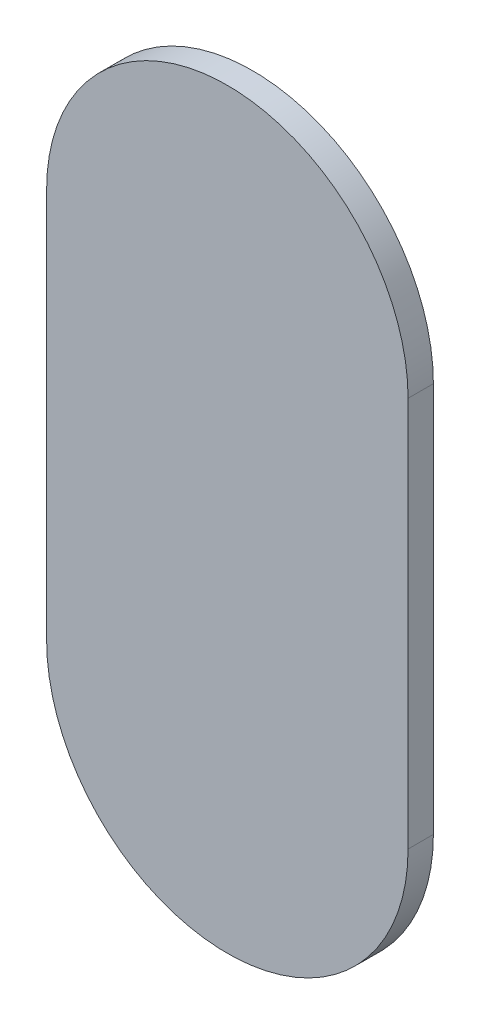
ISO-10303-21;
HEADER;
FILE_DESCRIPTION(('STEP AP214'),'2;1');
FILE_NAME('part.step','',(''),(''),'','','');
FILE_SCHEMA(('AUTOMOTIVE_DESIGN { 1 0 10303 214 1 1 1 1 }'));
ENDSEC;
DATA;
#1=APPLICATION_CONTEXT('core data for automotive mechanical design processes');
#2=APPLICATION_PROTOCOL_DEFINITION('international standard','automotive_design',2000,#1);
#3=PRODUCT_CONTEXT('',#1,'mechanical');
#4=PRODUCT('Part','Part','',(#3));
#5=PRODUCT_RELATED_PRODUCT_CATEGORY('part','',(#4));
#6=PRODUCT_DEFINITION_FORMATION('','',#4);
#7=PRODUCT_DEFINITION_CONTEXT('part definition',#1,'design');
#8=PRODUCT_DEFINITION('design','',#6,#7);
#9=PRODUCT_DEFINITION_SHAPE('','',#8);
#10=(LENGTH_UNIT() NAMED_UNIT(*) SI_UNIT(.MILLI.,.METRE.));
#11=(NAMED_UNIT(*) PLANE_ANGLE_UNIT() SI_UNIT($,.RADIAN.));
#12=(NAMED_UNIT(*) SI_UNIT($,.STERADIAN.) SOLID_ANGLE_UNIT());
#13=UNCERTAINTY_MEASURE_WITH_UNIT(LENGTH_MEASURE(1.E-05),#10,'distance_accuracy_value','');
#14=(GEOMETRIC_REPRESENTATION_CONTEXT(3) GLOBAL_UNCERTAINTY_ASSIGNED_CONTEXT((#13)) GLOBAL_UNIT_ASSIGNED_CONTEXT((#10,
#11,#12)) REPRESENTATION_CONTEXT('',''));
#15=CARTESIAN_POINT('',(0.,0.,0.));
#16=DIRECTION('',(0.,0.,1.));
#17=DIRECTION('',(1.,0.,0.));
#18=AXIS2_PLACEMENT_3D('',#15,#16,#17);
#19=CARTESIAN_POINT('',(108.05,-128.05,1.635));
#20=DIRECTION('',(0.,0.,1.));
#21=DIRECTION('',(1.,0.,0.));
#22=AXIS2_PLACEMENT_3D('',#19,#20,#21);
#23=PLANE('',#22);
#24=DIRECTION('',(0.,1.,0.));
#25=VECTOR('',#24,1.);
#26=CARTESIAN_POINT('',(108.05,-128.05,1.635));
#27=LINE('',#26,#25);
#28=CARTESIAN_POINT('',(108.05,-128.05,1.635));
#29=VERTEX_POINT('',#28);
#30=CARTESIAN_POINT('',(108.05,-127.51,1.635));
#31=VERTEX_POINT('',#30);
#32=EDGE_CURVE('E78',#29,#31,#27,.T.);
#33=ORIENTED_EDGE('',*,*,#32,.T.);
#34=CARTESIAN_POINT('',(107.8,-127.51,1.635));
#35=DIRECTION('',(0.,0.,1.));
#36=DIRECTION('',(1.,0.,0.));
#37=AXIS2_PLACEMENT_3D('',#34,#35,#36);
#38=CIRCLE('',#37,0.25);
#39=CARTESIAN_POINT('',(107.55,-127.51,1.635));
#40=VERTEX_POINT('',#39);
#41=EDGE_CURVE('E76',#31,#40,#38,.T.);
#42=ORIENTED_EDGE('',*,*,#41,.T.);
#43=DIRECTION('',(0.,-1.,0.));
#44=VECTOR('',#43,1.);
#45=CARTESIAN_POINT('',(107.55,-127.51,1.635));
#46=LINE('',#45,#44);
#47=CARTESIAN_POINT('',(107.55,-128.05,1.635));
#48=VERTEX_POINT('',#47);
#49=EDGE_CURVE('E64',#40,#48,#46,.T.);
#50=ORIENTED_EDGE('',*,*,#49,.T.);
#51=CARTESIAN_POINT('',(107.8,-128.05,1.635));
#52=DIRECTION('',(0.,0.,1.));
#53=DIRECTION('',(-1.,0.,0.));
#54=AXIS2_PLACEMENT_3D('',#51,#52,#53);
#55=CIRCLE('',#54,0.25);
#56=EDGE_CURVE('E11',#48,#29,#55,.T.);
#57=ORIENTED_EDGE('',*,*,#56,.T.);
#58=EDGE_LOOP('',(#33,#42,#50,#57));
#59=FACE_BOUND('',#58,.T.);
#60=ADVANCED_FACE('F17',(#59),#23,.T.);
#61=CARTESIAN_POINT('',(108.05,-128.05,1.6));
#62=DIRECTION('',(0.,0.,1.));
#63=DIRECTION('',(1.,0.,0.));
#64=AXIS2_PLACEMENT_3D('',#61,#62,#63);
#65=PLANE('',#64);
#66=CARTESIAN_POINT('',(107.8,-128.05,1.6));
#67=DIRECTION('',(0.,0.,1.));
#68=DIRECTION('',(-1.,0.,0.));
#69=AXIS2_PLACEMENT_3D('',#66,#67,#68);
#70=CIRCLE('',#69,0.25);
#71=CARTESIAN_POINT('',(107.55,-128.05,1.6));
#72=VERTEX_POINT('',#71);
#73=CARTESIAN_POINT('',(108.05,-128.05,1.6));
#74=VERTEX_POINT('',#73);
#75=EDGE_CURVE('E27',#72,#74,#70,.T.);
#76=ORIENTED_EDGE('',*,*,#75,.F.);
#77=DIRECTION('',(0.,-1.,0.));
#78=VECTOR('',#77,1.);
#79=CARTESIAN_POINT('',(107.55,-127.51,1.6));
#80=LINE('',#79,#78);
#81=CARTESIAN_POINT('',(107.55,-127.51,1.6));
#82=VERTEX_POINT('',#81);
#83=EDGE_CURVE('E83',#82,#72,#80,.T.);
#84=ORIENTED_EDGE('',*,*,#83,.F.);
#85=CARTESIAN_POINT('',(107.8,-127.51,1.6));
#86=DIRECTION('',(0.,0.,1.));
#87=DIRECTION('',(1.,0.,0.));
#88=AXIS2_PLACEMENT_3D('',#85,#86,#87);
#89=CIRCLE('',#88,0.25);
#90=CARTESIAN_POINT('',(108.05,-127.51,1.6));
#91=VERTEX_POINT('',#90);
#92=EDGE_CURVE('E86',#91,#82,#89,.T.);
#93=ORIENTED_EDGE('',*,*,#92,.F.);
#94=DIRECTION('',(0.,1.,0.));
#95=VECTOR('',#94,1.);
#96=CARTESIAN_POINT('',(108.05,-128.05,1.6));
#97=LINE('',#96,#95);
#98=EDGE_CURVE('E117',#74,#91,#97,.T.);
#99=ORIENTED_EDGE('',*,*,#98,.F.);
#100=EDGE_LOOP('',(#76,#84,#93,#99));
#101=FACE_BOUND('',#100,.T.);
#102=ADVANCED_FACE('F19',(#101),#65,.F.);
#103=CARTESIAN_POINT('',(107.8,-128.05,1.6));
#104=DIRECTION('',(0.,0.,-1.));
#105=DIRECTION('',(-1.,0.,0.));
#106=AXIS2_PLACEMENT_3D('',#103,#104,#105);
#107=CYLINDRICAL_SURFACE('',#106,0.25);
#108=ORIENTED_EDGE('',*,*,#75,.T.);
#109=DIRECTION('',(0.,0.,1.));
#110=VECTOR('',#109,1.);
#111=CARTESIAN_POINT('',(108.05,-128.05,1.6));
#112=LINE('',#111,#110);
#113=EDGE_CURVE('E93',#74,#29,#112,.T.);
#114=ORIENTED_EDGE('',*,*,#113,.T.);
#115=ORIENTED_EDGE('',*,*,#56,.F.);
#116=DIRECTION('',(0.,0.,1.));
#117=VECTOR('',#116,1.);
#118=CARTESIAN_POINT('',(107.55,-128.05,1.6));
#119=LINE('',#118,#117);
#120=EDGE_CURVE('E71',#72,#48,#119,.T.);
#121=ORIENTED_EDGE('',*,*,#120,.F.);
#122=EDGE_LOOP('',(#108,#114,#115,#121));
#123=FACE_BOUND('',#122,.T.);
#124=ADVANCED_FACE('F111',(#123),#107,.T.);
#125=CARTESIAN_POINT('',(107.55,-127.51,1.6));
#126=DIRECTION('',(1.,0.,0.));
#127=DIRECTION('',(0.,1.,0.));
#128=AXIS2_PLACEMENT_3D('',#125,#126,#127);
#129=PLANE('',#128);
#130=ORIENTED_EDGE('',*,*,#83,.T.);
#131=ORIENTED_EDGE('',*,*,#120,.T.);
#132=ORIENTED_EDGE('',*,*,#49,.F.);
#133=DIRECTION('',(0.,0.,1.));
#134=VECTOR('',#133,1.);
#135=CARTESIAN_POINT('',(107.55,-127.51,1.6));
#136=LINE('',#135,#134);
#137=EDGE_CURVE('E69',#82,#40,#136,.T.);
#138=ORIENTED_EDGE('',*,*,#137,.F.);
#139=EDGE_LOOP('',(#130,#131,#132,#138));
#140=FACE_BOUND('',#139,.T.);
#141=ADVANCED_FACE('F67',(#140),#129,.F.);
#142=CARTESIAN_POINT('',(107.8,-127.51,1.6));
#143=DIRECTION('',(0.,0.,-1.));
#144=DIRECTION('',(1.,0.,0.));
#145=AXIS2_PLACEMENT_3D('',#142,#143,#144);
#146=CYLINDRICAL_SURFACE('',#145,0.25);
#147=ORIENTED_EDGE('',*,*,#92,.T.);
#148=ORIENTED_EDGE('',*,*,#137,.T.);
#149=ORIENTED_EDGE('',*,*,#41,.F.);
#150=DIRECTION('',(0.,0.,1.));
#151=VECTOR('',#150,1.);
#152=CARTESIAN_POINT('',(108.05,-127.51,1.6));
#153=LINE('',#152,#151);
#154=EDGE_CURVE('E96',#91,#31,#153,.T.);
#155=ORIENTED_EDGE('',*,*,#154,.F.);
#156=EDGE_LOOP('',(#147,#148,#149,#155));
#157=FACE_BOUND('',#156,.T.);
#158=ADVANCED_FACE('F85',(#157),#146,.T.);
#159=CARTESIAN_POINT('',(108.05,-128.05,1.6));
#160=DIRECTION('',(-1.,0.,0.));
#161=DIRECTION('',(0.,0.,1.));
#162=AXIS2_PLACEMENT_3D('',#159,#160,#161);
#163=PLANE('',#162);
#164=ORIENTED_EDGE('',*,*,#98,.T.);
#165=ORIENTED_EDGE('',*,*,#154,.T.);
#166=ORIENTED_EDGE('',*,*,#32,.F.);
#167=ORIENTED_EDGE('',*,*,#113,.F.);
#168=EDGE_LOOP('',(#164,#165,#166,#167));
#169=FACE_BOUND('',#168,.T.);
#170=ADVANCED_FACE('F116',(#169),#163,.F.);
#171=CLOSED_SHELL('',(#60,#102,#124,#141,#158,#170));
#172=MANIFOLD_SOLID_BREP('B1',#171);
#173=ADVANCED_BREP_SHAPE_REPRESENTATION('',(#18,#172),#14);
#174=SHAPE_DEFINITION_REPRESENTATION(#9,#173);
ENDSEC;
END-ISO-10303-21;
